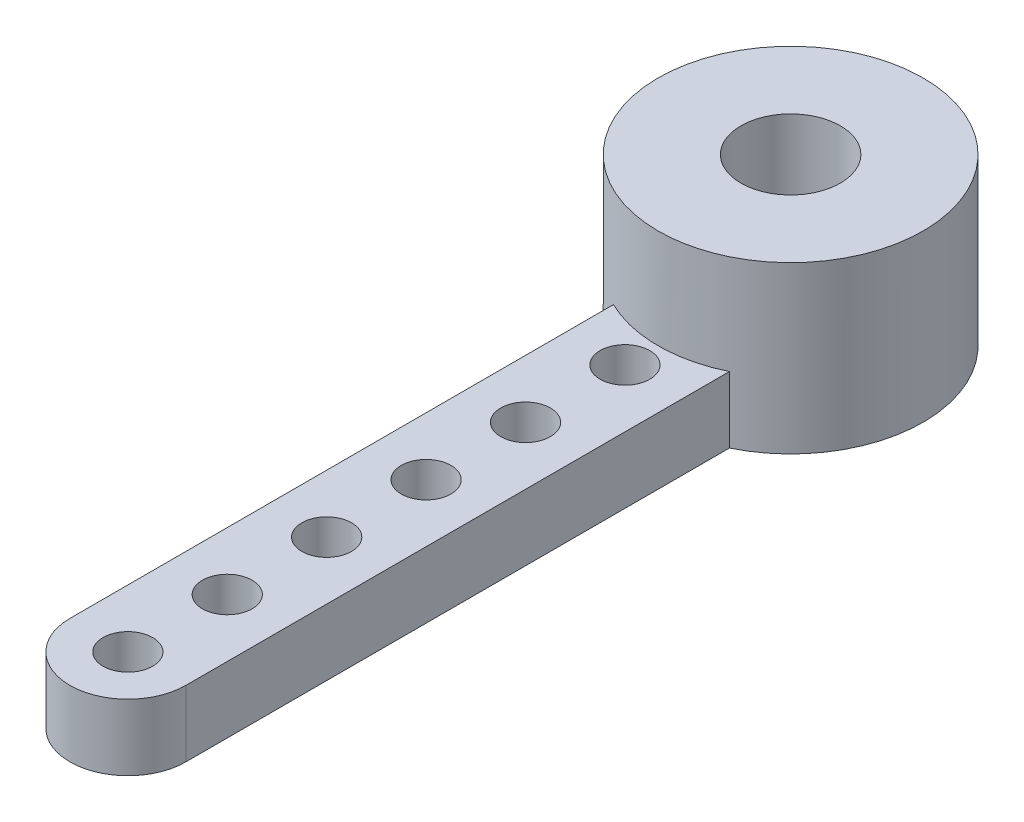
ISO-10303-21;
HEADER;
FILE_DESCRIPTION(('STEP AP214'),'2;1');
FILE_NAME('part.step','',(''),(''),'','','');
FILE_SCHEMA(('AUTOMOTIVE_DESIGN { 1 0 10303 214 1 1 1 1 }'));
ENDSEC;
DATA;
#1=APPLICATION_CONTEXT('core data for automotive mechanical design processes');
#2=APPLICATION_PROTOCOL_DEFINITION('international standard','automotive_design',2000,#1);
#3=PRODUCT_CONTEXT('',#1,'mechanical');
#4=PRODUCT('Part','Part','',(#3));
#5=PRODUCT_RELATED_PRODUCT_CATEGORY('part','',(#4));
#6=PRODUCT_DEFINITION_FORMATION('','',#4);
#7=PRODUCT_DEFINITION_CONTEXT('part definition',#1,'design');
#8=PRODUCT_DEFINITION('design','',#6,#7);
#9=PRODUCT_DEFINITION_SHAPE('','',#8);
#10=(LENGTH_UNIT() NAMED_UNIT(*) SI_UNIT(.MILLI.,.METRE.));
#11=(NAMED_UNIT(*) PLANE_ANGLE_UNIT() SI_UNIT($,.RADIAN.));
#12=(NAMED_UNIT(*) SI_UNIT($,.STERADIAN.) SOLID_ANGLE_UNIT());
#13=UNCERTAINTY_MEASURE_WITH_UNIT(LENGTH_MEASURE(1.E-05),#10,'distance_accuracy_value','');
#14=(GEOMETRIC_REPRESENTATION_CONTEXT(3) GLOBAL_UNCERTAINTY_ASSIGNED_CONTEXT((#13)) GLOBAL_UNIT_ASSIGNED_CONTEXT((#10,
#11,#12)) REPRESENTATION_CONTEXT('',''));
#15=CARTESIAN_POINT('',(0.,0.,0.));
#16=DIRECTION('',(0.,0.,1.));
#17=DIRECTION('',(1.,0.,0.));
#18=AXIS2_PLACEMENT_3D('',#15,#16,#17);
#19=CARTESIAN_POINT('',(-3.5,10.,0.));
#20=DIRECTION('',(1.,0.,0.));
#21=DIRECTION('',(0.,0.,-1.));
#22=AXIS2_PLACEMENT_3D('',#19,#20,#21);
#23=PLANE('',#22);
#24=DIRECTION('',(0.,0.,1.));
#25=VECTOR('',#24,1.);
#26=CARTESIAN_POINT('',(-3.49999999999999,4.,40.));
#27=LINE('',#26,#25);
#28=CARTESIAN_POINT('',(-3.49999999999999,4.,7.19374728496908));
#29=VERTEX_POINT('',#28);
#30=CARTESIAN_POINT('',(-3.49999999999999,4.,40.));
#31=VERTEX_POINT('',#30);
#32=EDGE_CURVE('E83',#29,#31,#27,.T.);
#33=ORIENTED_EDGE('',*,*,#32,.F.);
#34=DIRECTION('',(0.,-1.,0.));
#35=VECTOR('',#34,1.);
#36=CARTESIAN_POINT('',(-3.49999999999999,10.,7.19374728496908));
#37=LINE('',#36,#35);
#38=CARTESIAN_POINT('',(-3.49999999999999,0.,7.19374728496908));
#39=VERTEX_POINT('',#38);
#40=EDGE_CURVE('E11',#29,#39,#37,.T.);
#41=ORIENTED_EDGE('',*,*,#40,.T.);
#42=DIRECTION('',(0.,0.,1.));
#43=VECTOR('',#42,1.);
#44=CARTESIAN_POINT('',(-3.5,0.,0.));
#45=LINE('',#44,#43);
#46=CARTESIAN_POINT('',(-3.49999999999999,0.,40.));
#47=VERTEX_POINT('',#46);
#48=EDGE_CURVE('E125',#39,#47,#45,.T.);
#49=ORIENTED_EDGE('',*,*,#48,.T.);
#50=DIRECTION('',(0.,-1.,0.));
#51=VECTOR('',#50,1.);
#52=CARTESIAN_POINT('',(-3.49999999999999,10.,40.));
#53=LINE('',#52,#51);
#54=EDGE_CURVE('E43',#31,#47,#53,.T.);
#55=ORIENTED_EDGE('',*,*,#54,.F.);
#56=EDGE_LOOP('',(#33,#41,#49,#55));
#57=FACE_BOUND('',#56,.T.);
#58=ADVANCED_FACE('F34',(#57),#23,.F.);
#59=CARTESIAN_POINT('',(0.,10.,40.));
#60=DIRECTION('',(0.,-1.,0.));
#61=DIRECTION('',(0.,0.,-1.));
#62=AXIS2_PLACEMENT_3D('',#59,#60,#61);
#63=CYLINDRICAL_SURFACE('',#62,3.49999999999999);
#64=CARTESIAN_POINT('',(0.,4.,40.));
#65=DIRECTION('',(0.,1.,0.));
#66=DIRECTION('',(0.,0.,1.));
#67=AXIS2_PLACEMENT_3D('',#64,#65,#66);
#68=CIRCLE('',#67,3.49999999999999);
#69=CARTESIAN_POINT('',(3.49999999999999,4.,40.));
#70=VERTEX_POINT('',#69);
#71=EDGE_CURVE('E79',#31,#70,#68,.T.);
#72=ORIENTED_EDGE('',*,*,#71,.F.);
#73=ORIENTED_EDGE('',*,*,#54,.T.);
#74=CARTESIAN_POINT('',(0.,0.,40.));
#75=DIRECTION('',(0.,1.,0.));
#76=DIRECTION('',(0.,0.,1.));
#77=AXIS2_PLACEMENT_3D('',#74,#75,#76);
#78=CIRCLE('',#77,3.49999999999999);
#79=CARTESIAN_POINT('',(3.5,0.,40.));
#80=VERTEX_POINT('',#79);
#81=EDGE_CURVE('E92',#47,#80,#78,.T.);
#82=ORIENTED_EDGE('',*,*,#81,.T.);
#83=DIRECTION('',(0.,-1.,0.));
#84=VECTOR('',#83,1.);
#85=CARTESIAN_POINT('',(3.5,10.,40.));
#86=LINE('',#85,#84);
#87=EDGE_CURVE('E59',#70,#80,#86,.T.);
#88=ORIENTED_EDGE('',*,*,#87,.F.);
#89=EDGE_LOOP('',(#72,#73,#82,#88));
#90=FACE_BOUND('',#89,.T.);
#91=ADVANCED_FACE('F90',(#90),#63,.T.);
#92=CARTESIAN_POINT('',(0.,10.,34.));
#93=DIRECTION('',(0.,-1.,0.));
#94=DIRECTION('',(0.,0.,-1.));
#95=AXIS2_PLACEMENT_3D('',#92,#93,#94);
#96=CYLINDRICAL_SURFACE('',#95,1.5);
#97=CARTESIAN_POINT('',(0.,0.,34.));
#98=DIRECTION('',(0.,1.,0.));
#99=DIRECTION('',(0.,0.,1.));
#100=AXIS2_PLACEMENT_3D('',#97,#98,#99);
#101=CIRCLE('',#100,1.5);
#102=CARTESIAN_POINT('',(0.,0.,35.5));
#103=VERTEX_POINT('',#102);
#104=EDGE_CURVE('E143',#103,#103,#101,.T.);
#105=ORIENTED_EDGE('',*,*,#104,.F.);
#106=EDGE_LOOP('',(#105));
#107=FACE_BOUND('',#106,.T.);
#108=CARTESIAN_POINT('',(0.,4.,34.));
#109=DIRECTION('',(0.,1.,0.));
#110=DIRECTION('',(0.,0.,1.));
#111=AXIS2_PLACEMENT_3D('',#108,#109,#110);
#112=CIRCLE('',#111,1.5);
#113=CARTESIAN_POINT('',(0.,4.,35.5));
#114=VERTEX_POINT('',#113);
#115=EDGE_CURVE('E109',#114,#114,#112,.T.);
#116=ORIENTED_EDGE('',*,*,#115,.T.);
#117=EDGE_LOOP('',(#116));
#118=FACE_BOUND('',#117,.T.);
#119=ADVANCED_FACE('F203',(#107,#118),#96,.F.);
#120=CARTESIAN_POINT('',(0.,10.,28.));
#121=DIRECTION('',(0.,-1.,0.));
#122=DIRECTION('',(0.,0.,-1.));
#123=AXIS2_PLACEMENT_3D('',#120,#121,#122);
#124=CYLINDRICAL_SURFACE('',#123,1.5);
#125=CARTESIAN_POINT('',(0.,0.,28.));
#126=DIRECTION('',(0.,1.,0.));
#127=DIRECTION('',(0.,0.,1.));
#128=AXIS2_PLACEMENT_3D('',#125,#126,#127);
#129=CIRCLE('',#128,1.5);
#130=CARTESIAN_POINT('',(0.,0.,29.5));
#131=VERTEX_POINT('',#130);
#132=EDGE_CURVE('E140',#131,#131,#129,.T.);
#133=ORIENTED_EDGE('',*,*,#132,.F.);
#134=EDGE_LOOP('',(#133));
#135=FACE_BOUND('',#134,.T.);
#136=CARTESIAN_POINT('',(0.,4.,28.));
#137=DIRECTION('',(0.,1.,0.));
#138=DIRECTION('',(0.,0.,1.));
#139=AXIS2_PLACEMENT_3D('',#136,#137,#138);
#140=CIRCLE('',#139,1.5);
#141=CARTESIAN_POINT('',(0.,4.,29.5));
#142=VERTEX_POINT('',#141);
#143=EDGE_CURVE('E114',#142,#142,#140,.T.);
#144=ORIENTED_EDGE('',*,*,#143,.T.);
#145=EDGE_LOOP('',(#144));
#146=FACE_BOUND('',#145,.T.);
#147=ADVANCED_FACE('F171',(#135,#146),#124,.F.);
#148=CARTESIAN_POINT('',(0.,10.,22.));
#149=DIRECTION('',(0.,-1.,0.));
#150=DIRECTION('',(0.,0.,-1.));
#151=AXIS2_PLACEMENT_3D('',#148,#149,#150);
#152=CYLINDRICAL_SURFACE('',#151,1.5);
#153=CARTESIAN_POINT('',(0.,0.,22.));
#154=DIRECTION('',(0.,1.,0.));
#155=DIRECTION('',(0.,0.,1.));
#156=AXIS2_PLACEMENT_3D('',#153,#154,#155);
#157=CIRCLE('',#156,1.5);
#158=CARTESIAN_POINT('',(0.,0.,23.5));
#159=VERTEX_POINT('',#158);
#160=EDGE_CURVE('E137',#159,#159,#157,.T.);
#161=ORIENTED_EDGE('',*,*,#160,.F.);
#162=EDGE_LOOP('',(#161));
#163=FACE_BOUND('',#162,.T.);
#164=CARTESIAN_POINT('',(0.,4.,22.));
#165=DIRECTION('',(0.,1.,0.));
#166=DIRECTION('',(0.,0.,1.));
#167=AXIS2_PLACEMENT_3D('',#164,#165,#166);
#168=CIRCLE('',#167,1.5);
#169=CARTESIAN_POINT('',(0.,4.,23.5));
#170=VERTEX_POINT('',#169);
#171=EDGE_CURVE('E166',#170,#170,#168,.T.);
#172=ORIENTED_EDGE('',*,*,#171,.T.);
#173=EDGE_LOOP('',(#172));
#174=FACE_BOUND('',#173,.T.);
#175=ADVANCED_FACE('F194',(#163,#174),#152,.F.);
#176=CARTESIAN_POINT('',(0.,10.,16.));
#177=DIRECTION('',(0.,-1.,0.));
#178=DIRECTION('',(0.,0.,-1.));
#179=AXIS2_PLACEMENT_3D('',#176,#177,#178);
#180=CYLINDRICAL_SURFACE('',#179,1.5);
#181=CARTESIAN_POINT('',(0.,0.,16.));
#182=DIRECTION('',(0.,1.,0.));
#183=DIRECTION('',(0.,0.,1.));
#184=AXIS2_PLACEMENT_3D('',#181,#182,#183);
#185=CIRCLE('',#184,1.5);
#186=CARTESIAN_POINT('',(0.,0.,17.5));
#187=VERTEX_POINT('',#186);
#188=EDGE_CURVE('E134',#187,#187,#185,.T.);
#189=ORIENTED_EDGE('',*,*,#188,.F.);
#190=EDGE_LOOP('',(#189));
#191=FACE_BOUND('',#190,.T.);
#192=CARTESIAN_POINT('',(0.,4.,16.));
#193=DIRECTION('',(0.,1.,0.));
#194=DIRECTION('',(0.,0.,1.));
#195=AXIS2_PLACEMENT_3D('',#192,#193,#194);
#196=CIRCLE('',#195,1.5);
#197=CARTESIAN_POINT('',(0.,4.,17.5));
#198=VERTEX_POINT('',#197);
#199=EDGE_CURVE('E159',#198,#198,#196,.T.);
#200=ORIENTED_EDGE('',*,*,#199,.T.);
#201=EDGE_LOOP('',(#200));
#202=FACE_BOUND('',#201,.T.);
#203=ADVANCED_FACE('F186',(#191,#202),#180,.F.);
#204=CARTESIAN_POINT('',(-1.04744440165294E-13,10.,10.));
#205=DIRECTION('',(0.,-1.,0.));
#206=DIRECTION('',(0.,0.,-1.));
#207=AXIS2_PLACEMENT_3D('',#204,#205,#206);
#208=CYLINDRICAL_SURFACE('',#207,1.5);
#209=CARTESIAN_POINT('',(-1.04744440165294E-13,0.,10.));
#210=DIRECTION('',(0.,1.,0.));
#211=DIRECTION('',(0.,0.,1.));
#212=AXIS2_PLACEMENT_3D('',#209,#210,#211);
#213=CIRCLE('',#212,1.5);
#214=CARTESIAN_POINT('',(-1.04744440165294E-13,0.,11.5));
#215=VERTEX_POINT('',#214);
#216=EDGE_CURVE('E131',#215,#215,#213,.T.);
#217=ORIENTED_EDGE('',*,*,#216,.F.);
#218=EDGE_LOOP('',(#217));
#219=FACE_BOUND('',#218,.T.);
#220=CARTESIAN_POINT('',(-1.04744440165294E-13,4.,10.));
#221=DIRECTION('',(0.,1.,0.));
#222=DIRECTION('',(0.,0.,1.));
#223=AXIS2_PLACEMENT_3D('',#220,#221,#222);
#224=CIRCLE('',#223,1.5);
#225=CARTESIAN_POINT('',(-1.04744440165294E-13,4.,11.5));
#226=VERTEX_POINT('',#225);
#227=EDGE_CURVE('E157',#226,#226,#224,.T.);
#228=ORIENTED_EDGE('',*,*,#227,.T.);
#229=EDGE_LOOP('',(#228));
#230=FACE_BOUND('',#229,.T.);
#231=ADVANCED_FACE('F184',(#219,#230),#208,.F.);
#232=CARTESIAN_POINT('',(3.5,10.,0.));
#233=DIRECTION('',(1.,0.,0.));
#234=DIRECTION('',(0.,0.,-1.));
#235=AXIS2_PLACEMENT_3D('',#232,#233,#234);
#236=PLANE('',#235);
#237=DIRECTION('',(0.,-1.,0.));
#238=VECTOR('',#237,1.);
#239=CARTESIAN_POINT('',(3.5,10.,7.19374728496908));
#240=LINE('',#239,#238);
#241=CARTESIAN_POINT('',(3.5,4.,7.19374728496908));
#242=VERTEX_POINT('',#241);
#243=CARTESIAN_POINT('',(3.5,0.,7.19374728496908));
#244=VERTEX_POINT('',#243);
#245=EDGE_CURVE('E51',#242,#244,#240,.T.);
#246=ORIENTED_EDGE('',*,*,#245,.F.);
#247=DIRECTION('',(0.,0.,-1.));
#248=VECTOR('',#247,1.);
#249=CARTESIAN_POINT('',(3.49999999999999,4.,40.));
#250=LINE('',#249,#248);
#251=EDGE_CURVE('E81',#70,#242,#250,.T.);
#252=ORIENTED_EDGE('',*,*,#251,.F.);
#253=ORIENTED_EDGE('',*,*,#87,.T.);
#254=DIRECTION('',(0.,0.,1.));
#255=VECTOR('',#254,1.);
#256=CARTESIAN_POINT('',(3.5,0.,0.));
#257=LINE('',#256,#255);
#258=EDGE_CURVE('E129',#244,#80,#257,.T.);
#259=ORIENTED_EDGE('',*,*,#258,.F.);
#260=EDGE_LOOP('',(#246,#252,#253,#259));
#261=FACE_BOUND('',#260,.T.);
#262=ADVANCED_FACE('F87',(#261),#236,.T.);
#263=CARTESIAN_POINT('',(0.,10.,40.));
#264=DIRECTION('',(0.,-1.,0.));
#265=DIRECTION('',(0.,0.,-1.));
#266=AXIS2_PLACEMENT_3D('',#263,#264,#265);
#267=CYLINDRICAL_SURFACE('',#266,1.5);
#268=CARTESIAN_POINT('',(0.,0.,40.));
#269=DIRECTION('',(0.,1.,0.));
#270=DIRECTION('',(0.,0.,1.));
#271=AXIS2_PLACEMENT_3D('',#268,#269,#270);
#272=CIRCLE('',#271,1.5);
#273=CARTESIAN_POINT('',(0.,0.,41.5));
#274=VERTEX_POINT('',#273);
#275=EDGE_CURVE('E123',#274,#274,#272,.T.);
#276=ORIENTED_EDGE('',*,*,#275,.F.);
#277=EDGE_LOOP('',(#276));
#278=FACE_BOUND('',#277,.T.);
#279=CARTESIAN_POINT('',(0.,4.,40.));
#280=DIRECTION('',(0.,1.,0.));
#281=DIRECTION('',(0.,0.,1.));
#282=AXIS2_PLACEMENT_3D('',#279,#280,#281);
#283=CIRCLE('',#282,1.5);
#284=CARTESIAN_POINT('',(0.,4.,41.5));
#285=VERTEX_POINT('',#284);
#286=EDGE_CURVE('E38',#285,#285,#283,.T.);
#287=ORIENTED_EDGE('',*,*,#286,.T.);
#288=EDGE_LOOP('',(#287));
#289=FACE_BOUND('',#288,.T.);
#290=ADVANCED_FACE('F150',(#278,#289),#267,.F.);
#291=CARTESIAN_POINT('',(0.,10.,0.));
#292=DIRECTION('',(0.,-1.,0.));
#293=DIRECTION('',(0.,0.,-1.));
#294=AXIS2_PLACEMENT_3D('',#291,#292,#293);
#295=CYLINDRICAL_SURFACE('',#294,8.);
#296=ORIENTED_EDGE('',*,*,#40,.F.);
#297=CARTESIAN_POINT('',(0.,4.,0.));
#298=DIRECTION('',(0.,-1.,0.));
#299=DIRECTION('',(0.,0.,-1.));
#300=AXIS2_PLACEMENT_3D('',#297,#298,#299);
#301=CIRCLE('',#300,8.);
#302=EDGE_CURVE('E88',#242,#29,#301,.T.);
#303=ORIENTED_EDGE('',*,*,#302,.F.);
#304=ORIENTED_EDGE('',*,*,#245,.T.);
#305=CARTESIAN_POINT('',(0.,0.,0.));
#306=DIRECTION('',(0.,1.,0.));
#307=DIRECTION('',(0.,0.,1.));
#308=AXIS2_PLACEMENT_3D('',#305,#306,#307);
#309=CIRCLE('',#308,8.);
#310=EDGE_CURVE('E119',#244,#39,#309,.T.);
#311=ORIENTED_EDGE('',*,*,#310,.T.);
#312=EDGE_LOOP('',(#296,#303,#304,#311));
#313=FACE_BOUND('',#312,.T.);
#314=CARTESIAN_POINT('',(0.,10.,0.));
#315=DIRECTION('',(0.,1.,0.));
#316=DIRECTION('',(0.,0.,1.));
#317=AXIS2_PLACEMENT_3D('',#314,#315,#316);
#318=CIRCLE('',#317,8.);
#319=CARTESIAN_POINT('',(0.,10.,8.));
#320=VERTEX_POINT('',#319);
#321=EDGE_CURVE('E96',#320,#320,#318,.T.);
#322=ORIENTED_EDGE('',*,*,#321,.F.);
#323=EDGE_LOOP('',(#322));
#324=FACE_BOUND('',#323,.T.);
#325=ADVANCED_FACE('F36',(#313,#324),#295,.T.);
#326=CARTESIAN_POINT('',(0.,10.,0.));
#327=DIRECTION('',(0.,1.,0.));
#328=DIRECTION('',(0.,0.,1.));
#329=AXIS2_PLACEMENT_3D('',#326,#327,#328);
#330=PLANE('',#329);
#331=ORIENTED_EDGE('',*,*,#321,.T.);
#332=EDGE_LOOP('',(#331));
#333=FACE_BOUND('',#332,.T.);
#334=CARTESIAN_POINT('',(0.,10.,0.));
#335=DIRECTION('',(0.,1.,0.));
#336=DIRECTION('',(0.,0.,1.));
#337=AXIS2_PLACEMENT_3D('',#334,#335,#336);
#338=CIRCLE('',#337,3.);
#339=CARTESIAN_POINT('',(0.,10.,3.));
#340=VERTEX_POINT('',#339);
#341=EDGE_CURVE('E101',#340,#340,#338,.T.);
#342=ORIENTED_EDGE('',*,*,#341,.F.);
#343=EDGE_LOOP('',(#342));
#344=FACE_BOUND('',#343,.T.);
#345=ADVANCED_FACE('F212',(#333,#344),#330,.T.);
#346=CARTESIAN_POINT('',(0.,0.,0.));
#347=DIRECTION('',(0.,1.,0.));
#348=DIRECTION('',(0.,0.,1.));
#349=AXIS2_PLACEMENT_3D('',#346,#347,#348);
#350=PLANE('',#349);
#351=CARTESIAN_POINT('',(0.,0.,0.));
#352=DIRECTION('',(0.,1.,0.));
#353=DIRECTION('',(0.,0.,1.));
#354=AXIS2_PLACEMENT_3D('',#351,#352,#353);
#355=CIRCLE('',#354,1.5);
#356=CARTESIAN_POINT('',(0.,0.,1.5));
#357=VERTEX_POINT('',#356);
#358=EDGE_CURVE('E99',#357,#357,#355,.T.);
#359=ORIENTED_EDGE('',*,*,#358,.T.);
#360=EDGE_LOOP('',(#359));
#361=FACE_BOUND('',#360,.T.);
#362=ORIENTED_EDGE('',*,*,#310,.F.);
#363=ORIENTED_EDGE('',*,*,#258,.T.);
#364=ORIENTED_EDGE('',*,*,#81,.F.);
#365=ORIENTED_EDGE('',*,*,#48,.F.);
#366=EDGE_LOOP('',(#362,#363,#364,#365));
#367=FACE_BOUND('',#366,.T.);
#368=ORIENTED_EDGE('',*,*,#216,.T.);
#369=EDGE_LOOP('',(#368));
#370=FACE_BOUND('',#369,.T.);
#371=ORIENTED_EDGE('',*,*,#188,.T.);
#372=EDGE_LOOP('',(#371));
#373=FACE_BOUND('',#372,.T.);
#374=ORIENTED_EDGE('',*,*,#160,.T.);
#375=EDGE_LOOP('',(#374));
#376=FACE_BOUND('',#375,.T.);
#377=ORIENTED_EDGE('',*,*,#132,.T.);
#378=EDGE_LOOP('',(#377));
#379=FACE_BOUND('',#378,.T.);
#380=ORIENTED_EDGE('',*,*,#104,.T.);
#381=EDGE_LOOP('',(#380));
#382=FACE_BOUND('',#381,.T.);
#383=ORIENTED_EDGE('',*,*,#275,.T.);
#384=EDGE_LOOP('',(#383));
#385=FACE_BOUND('',#384,.T.);
#386=ADVANCED_FACE('F148',(#361,#367,#370,#373,#376,#379,#382,#385),#350,.F.);
#387=CARTESIAN_POINT('',(0.,4.,0.));
#388=DIRECTION('',(0.,1.,0.));
#389=DIRECTION('',(0.,0.,1.));
#390=AXIS2_PLACEMENT_3D('',#387,#388,#389);
#391=CYLINDRICAL_SURFACE('',#390,3.);
#392=CARTESIAN_POINT('',(0.,4.,0.));
#393=DIRECTION('',(0.,1.,0.));
#394=DIRECTION('',(0.,0.,1.));
#395=AXIS2_PLACEMENT_3D('',#392,#393,#394);
#396=CIRCLE('',#395,3.);
#397=CARTESIAN_POINT('',(0.,4.,3.));
#398=VERTEX_POINT('',#397);
#399=EDGE_CURVE('E106',#398,#398,#396,.T.);
#400=ORIENTED_EDGE('',*,*,#399,.F.);
#401=EDGE_LOOP('',(#400));
#402=FACE_BOUND('',#401,.T.);
#403=ORIENTED_EDGE('',*,*,#341,.T.);
#404=EDGE_LOOP('',(#403));
#405=FACE_BOUND('',#404,.T.);
#406=ADVANCED_FACE('F211',(#402,#405),#391,.F.);
#407=CARTESIAN_POINT('',(0.,4.,0.));
#408=DIRECTION('',(0.,1.,0.));
#409=DIRECTION('',(0.,0.,1.));
#410=AXIS2_PLACEMENT_3D('',#407,#408,#409);
#411=PLANE('',#410);
#412=CARTESIAN_POINT('',(0.,4.,0.));
#413=DIRECTION('',(0.,1.,0.));
#414=DIRECTION('',(0.,0.,1.));
#415=AXIS2_PLACEMENT_3D('',#412,#413,#414);
#416=CIRCLE('',#415,1.5);
#417=CARTESIAN_POINT('',(0.,4.,1.5));
#418=VERTEX_POINT('',#417);
#419=EDGE_CURVE('E102',#418,#418,#416,.T.);
#420=ORIENTED_EDGE('',*,*,#419,.F.);
#421=EDGE_LOOP('',(#420));
#422=FACE_BOUND('',#421,.T.);
#423=ORIENTED_EDGE('',*,*,#399,.T.);
#424=EDGE_LOOP('',(#423));
#425=FACE_BOUND('',#424,.T.);
#426=ADVANCED_FACE('F295',(#422,#425),#411,.T.);
#427=CARTESIAN_POINT('',(0.,-2.,0.));
#428=DIRECTION('',(0.,1.,0.));
#429=DIRECTION('',(0.,0.,1.));
#430=AXIS2_PLACEMENT_3D('',#427,#428,#429);
#431=CYLINDRICAL_SURFACE('',#430,1.5);
#432=ORIENTED_EDGE('',*,*,#419,.T.);
#433=EDGE_LOOP('',(#432));
#434=FACE_BOUND('',#433,.T.);
#435=ORIENTED_EDGE('',*,*,#358,.F.);
#436=EDGE_LOOP('',(#435));
#437=FACE_BOUND('',#436,.T.);
#438=ADVANCED_FACE('F175',(#434,#437),#431,.F.);
#439=CARTESIAN_POINT('',(0.,4.,40.));
#440=DIRECTION('',(0.,1.,0.));
#441=DIRECTION('',(0.,0.,1.));
#442=AXIS2_PLACEMENT_3D('',#439,#440,#441);
#443=PLANE('',#442);
#444=ORIENTED_EDGE('',*,*,#115,.F.);
#445=EDGE_LOOP('',(#444));
#446=FACE_BOUND('',#445,.T.);
#447=ORIENTED_EDGE('',*,*,#143,.F.);
#448=EDGE_LOOP('',(#447));
#449=FACE_BOUND('',#448,.T.);
#450=ORIENTED_EDGE('',*,*,#171,.F.);
#451=EDGE_LOOP('',(#450));
#452=FACE_BOUND('',#451,.T.);
#453=ORIENTED_EDGE('',*,*,#199,.F.);
#454=EDGE_LOOP('',(#453));
#455=FACE_BOUND('',#454,.T.);
#456=ORIENTED_EDGE('',*,*,#227,.F.);
#457=EDGE_LOOP('',(#456));
#458=FACE_BOUND('',#457,.T.);
#459=ORIENTED_EDGE('',*,*,#286,.F.);
#460=EDGE_LOOP('',(#459));
#461=FACE_BOUND('',#460,.T.);
#462=ORIENTED_EDGE('',*,*,#71,.T.);
#463=ORIENTED_EDGE('',*,*,#251,.T.);
#464=ORIENTED_EDGE('',*,*,#302,.T.);
#465=ORIENTED_EDGE('',*,*,#32,.T.);
#466=EDGE_LOOP('',(#462,#463,#464,#465));
#467=FACE_BOUND('',#466,.T.);
#468=ADVANCED_FACE('F80',(#446,#449,#452,#455,#458,#461,#467),#443,.T.);
#469=CLOSED_SHELL('',(#58,#91,#119,#147,#175,#203,#231,#262,#290,#325,#345,#386,#406,#426,#438,#468));
#470=MANIFOLD_SOLID_BREP('B2',#469);
#471=ADVANCED_BREP_SHAPE_REPRESENTATION('',(#18,#470),#14);
#472=SHAPE_DEFINITION_REPRESENTATION(#9,#471);
ENDSEC;
END-ISO-10303-21;
